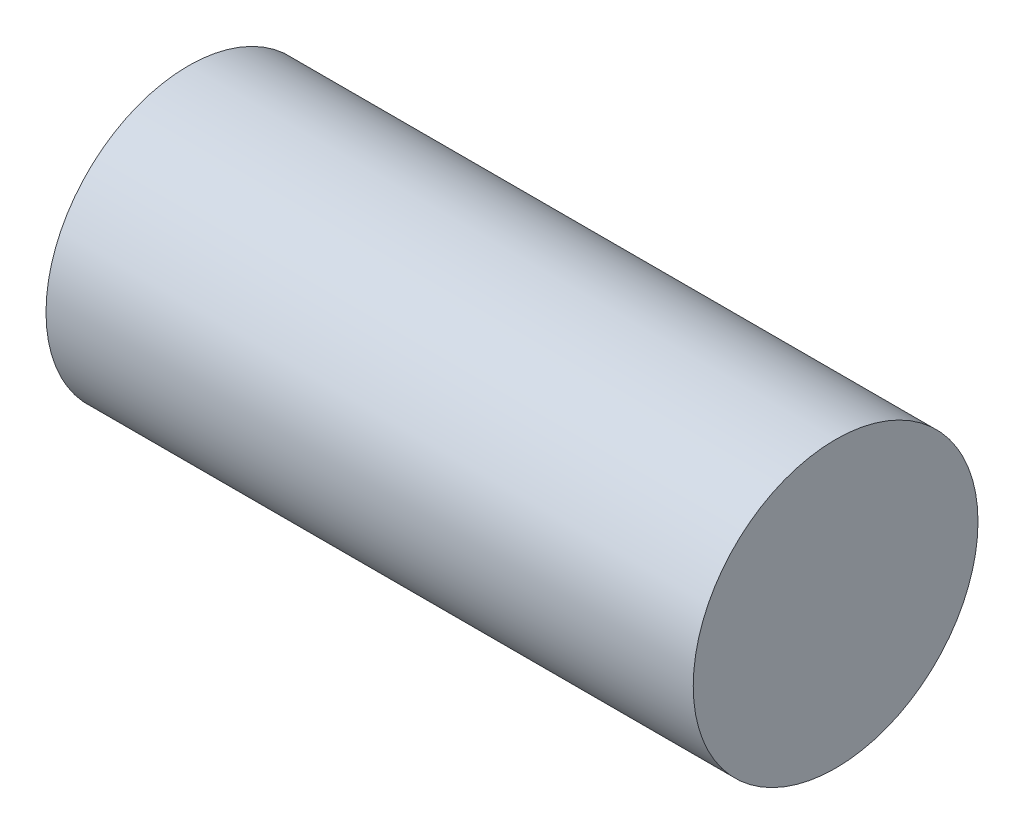
ISO-10303-21;
HEADER;
FILE_DESCRIPTION(('STEP AP214'),'2;1');
FILE_NAME('part.step','',(''),(''),'','','');
FILE_SCHEMA(('AUTOMOTIVE_DESIGN { 1 0 10303 214 1 1 1 1 }'));
ENDSEC;
DATA;
#1=APPLICATION_CONTEXT('core data for automotive mechanical design processes');
#2=APPLICATION_PROTOCOL_DEFINITION('international standard','automotive_design',2000,#1);
#3=PRODUCT_CONTEXT('',#1,'mechanical');
#4=PRODUCT('Part','Part','',(#3));
#5=PRODUCT_RELATED_PRODUCT_CATEGORY('part','',(#4));
#6=PRODUCT_DEFINITION_FORMATION('','',#4);
#7=PRODUCT_DEFINITION_CONTEXT('part definition',#1,'design');
#8=PRODUCT_DEFINITION('design','',#6,#7);
#9=PRODUCT_DEFINITION_SHAPE('','',#8);
#10=(LENGTH_UNIT() NAMED_UNIT(*) SI_UNIT(.MILLI.,.METRE.));
#11=(NAMED_UNIT(*) PLANE_ANGLE_UNIT() SI_UNIT($,.RADIAN.));
#12=(NAMED_UNIT(*) SI_UNIT($,.STERADIAN.) SOLID_ANGLE_UNIT());
#13=UNCERTAINTY_MEASURE_WITH_UNIT(LENGTH_MEASURE(1.E-05),#10,'distance_accuracy_value','');
#14=(GEOMETRIC_REPRESENTATION_CONTEXT(3) GLOBAL_UNCERTAINTY_ASSIGNED_CONTEXT((#13)) GLOBAL_UNIT_ASSIGNED_CONTEXT((#10,
#11,#12)) REPRESENTATION_CONTEXT('',''));
#15=CARTESIAN_POINT('',(0.,0.,0.));
#16=DIRECTION('',(0.,0.,1.));
#17=DIRECTION('',(1.,0.,0.));
#18=AXIS2_PLACEMENT_3D('',#15,#16,#17);
#19=CARTESIAN_POINT('',(50.,0.,0.));
#20=DIRECTION('',(-1.,0.,0.));
#21=DIRECTION('',(0.,0.,1.));
#22=AXIS2_PLACEMENT_3D('',#19,#20,#21);
#23=CYLINDRICAL_SURFACE('',#22,11.);
#24=CARTESIAN_POINT('',(50.,0.,0.));
#25=DIRECTION('',(1.,0.,0.));
#26=DIRECTION('',(0.,0.,-1.));
#27=AXIS2_PLACEMENT_3D('',#24,#25,#26);
#28=CIRCLE('',#27,11.);
#29=CARTESIAN_POINT('',(50.,0.,-11.));
#30=VERTEX_POINT('',#29);
#31=EDGE_CURVE('E10',#30,#30,#28,.T.);
#32=ORIENTED_EDGE('',*,*,#31,.F.);
#33=EDGE_LOOP('',(#32));
#34=FACE_BOUND('',#33,.T.);
#35=CARTESIAN_POINT('',(0.,0.,0.));
#36=DIRECTION('',(1.,0.,0.));
#37=DIRECTION('',(0.,0.,-1.));
#38=AXIS2_PLACEMENT_3D('',#35,#36,#37);
#39=CIRCLE('',#38,11.);
#40=CARTESIAN_POINT('',(0.,0.,-11.));
#41=VERTEX_POINT('',#40);
#42=EDGE_CURVE('E32',#41,#41,#39,.T.);
#43=ORIENTED_EDGE('',*,*,#42,.T.);
#44=EDGE_LOOP('',(#43));
#45=FACE_BOUND('',#44,.T.);
#46=ADVANCED_FACE('F29',(#34,#45),#23,.T.);
#47=CARTESIAN_POINT('',(50.,0.,0.));
#48=DIRECTION('',(1.,0.,0.));
#49=DIRECTION('',(0.,0.,-1.));
#50=AXIS2_PLACEMENT_3D('',#47,#48,#49);
#51=PLANE('',#50);
#52=ORIENTED_EDGE('',*,*,#31,.T.);
#53=EDGE_LOOP('',(#52));
#54=FACE_BOUND('',#53,.T.);
#55=ADVANCED_FACE('F44',(#54),#51,.T.);
#56=CARTESIAN_POINT('',(0.,0.,0.));
#57=DIRECTION('',(1.,0.,0.));
#58=DIRECTION('',(0.,0.,-1.));
#59=AXIS2_PLACEMENT_3D('',#56,#57,#58);
#60=PLANE('',#59);
#61=ORIENTED_EDGE('',*,*,#42,.F.);
#62=EDGE_LOOP('',(#61));
#63=FACE_BOUND('',#62,.T.);
#64=ADVANCED_FACE('F42',(#63),#60,.F.);
#65=CLOSED_SHELL('',(#46,#55,#64));
#66=MANIFOLD_SOLID_BREP('B2',#65);
#67=ADVANCED_BREP_SHAPE_REPRESENTATION('',(#18,#66),#14);
#68=SHAPE_DEFINITION_REPRESENTATION(#9,#67);
ENDSEC;
END-ISO-10303-21;
